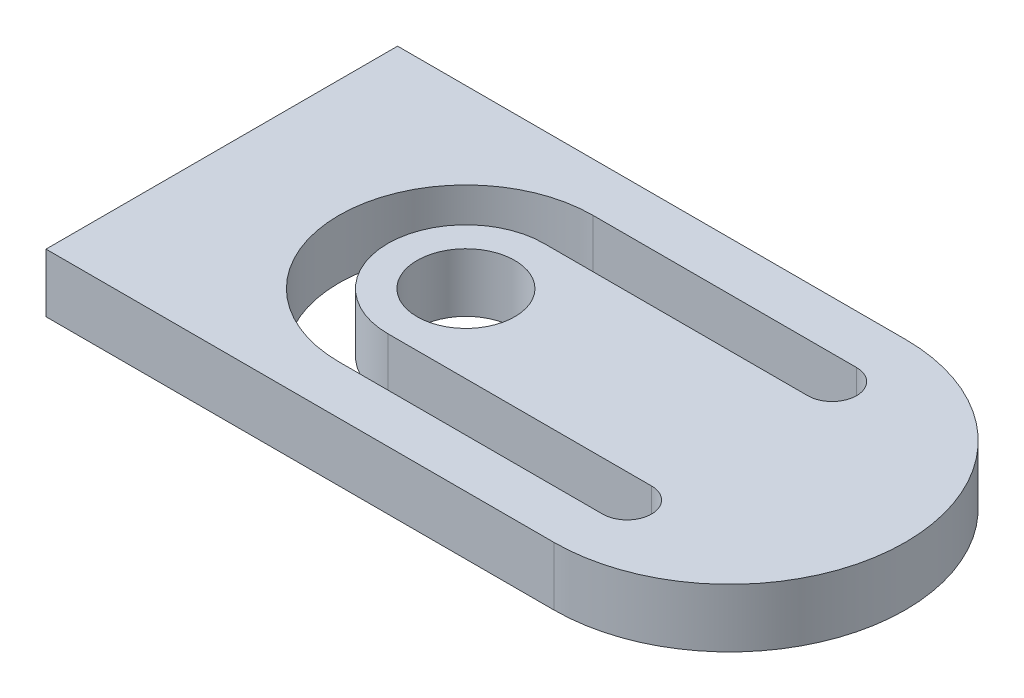
ISO-10303-21;
HEADER;
FILE_DESCRIPTION(('STEP AP214'),'2;1');
FILE_NAME('part.step','',(''),(''),'','','');
FILE_SCHEMA(('AUTOMOTIVE_DESIGN { 1 0 10303 214 1 1 1 1 }'));
ENDSEC;
DATA;
#1=APPLICATION_CONTEXT('core data for automotive mechanical design processes');
#2=APPLICATION_PROTOCOL_DEFINITION('international standard','automotive_design',2000,#1);
#3=PRODUCT_CONTEXT('',#1,'mechanical');
#4=PRODUCT('Part','Part','',(#3));
#5=PRODUCT_RELATED_PRODUCT_CATEGORY('part','',(#4));
#6=PRODUCT_DEFINITION_FORMATION('','',#4);
#7=PRODUCT_DEFINITION_CONTEXT('part definition',#1,'design');
#8=PRODUCT_DEFINITION('design','',#6,#7);
#9=PRODUCT_DEFINITION_SHAPE('','',#8);
#10=(LENGTH_UNIT() NAMED_UNIT(*) SI_UNIT(.MILLI.,.METRE.));
#11=(NAMED_UNIT(*) PLANE_ANGLE_UNIT() SI_UNIT($,.RADIAN.));
#12=(NAMED_UNIT(*) SI_UNIT($,.STERADIAN.) SOLID_ANGLE_UNIT());
#13=UNCERTAINTY_MEASURE_WITH_UNIT(LENGTH_MEASURE(1.E-05),#10,'distance_accuracy_value','');
#14=(GEOMETRIC_REPRESENTATION_CONTEXT(3) GLOBAL_UNCERTAINTY_ASSIGNED_CONTEXT((#13)) GLOBAL_UNIT_ASSIGNED_CONTEXT((#10,
#11,#12)) REPRESENTATION_CONTEXT('',''));
#15=CARTESIAN_POINT('',(0.,0.,0.));
#16=DIRECTION('',(0.,0.,1.));
#17=DIRECTION('',(1.,0.,0.));
#18=AXIS2_PLACEMENT_3D('',#15,#16,#17);
#19=CARTESIAN_POINT('',(6.64397905759164,3.,0.));
#20=DIRECTION('',(0.,-1.,0.));
#21=DIRECTION('',(0.,0.,-1.));
#22=AXIS2_PLACEMENT_3D('',#19,#20,#21);
#23=PLANE('',#22);
#24=CARTESIAN_POINT('',(-6.85602094240837,3.,0.));
#25=DIRECTION('',(0.,1.,0.));
#26=DIRECTION('',(0.,0.,1.));
#27=AXIS2_PLACEMENT_3D('',#24,#25,#26);
#28=CIRCLE('',#27,2.5);
#29=CARTESIAN_POINT('',(-6.85602094240837,3.,2.5));
#30=VERTEX_POINT('',#29);
#31=EDGE_CURVE('E188',#30,#30,#28,.T.);
#32=ORIENTED_EDGE('',*,*,#31,.F.);
#33=EDGE_LOOP('',(#32));
#34=FACE_BOUND('',#33,.T.);
#35=DIRECTION('',(0.,0.,1.));
#36=VECTOR('',#35,1.);
#37=CARTESIAN_POINT('',(-19.3560209424084,3.,-9.));
#38=LINE('',#37,#36);
#39=CARTESIAN_POINT('',(-19.3560209424084,3.,-9.));
#40=VERTEX_POINT('',#39);
#41=CARTESIAN_POINT('',(-19.3560209424084,3.,9.));
#42=VERTEX_POINT('',#41);
#43=EDGE_CURVE('E194',#40,#42,#38,.T.);
#44=ORIENTED_EDGE('',*,*,#43,.T.);
#45=DIRECTION('',(1.,0.,0.));
#46=VECTOR('',#45,1.);
#47=CARTESIAN_POINT('',(-19.3560209424084,3.,9.));
#48=LINE('',#47,#46);
#49=CARTESIAN_POINT('',(6.64397905759164,3.,9.00000000000001));
#50=VERTEX_POINT('',#49);
#51=EDGE_CURVE('E197',#42,#50,#48,.T.);
#52=ORIENTED_EDGE('',*,*,#51,.T.);
#53=CARTESIAN_POINT('',(6.64397905759164,3.,0.));
#54=DIRECTION('',(0.,1.,0.));
#55=DIRECTION('',(0.,0.,-1.));
#56=AXIS2_PLACEMENT_3D('',#53,#54,#55);
#57=CIRCLE('',#56,9.);
#58=CARTESIAN_POINT('',(6.64397905759163,3.,-9.));
#59=VERTEX_POINT('',#58);
#60=EDGE_CURVE('E200',#50,#59,#57,.T.);
#61=ORIENTED_EDGE('',*,*,#60,.T.);
#62=DIRECTION('',(-1.,0.,0.));
#63=VECTOR('',#62,1.);
#64=CARTESIAN_POINT('',(-19.3560209424084,3.,-9.));
#65=LINE('',#64,#63);
#66=EDGE_CURVE('E202',#59,#40,#65,.T.);
#67=ORIENTED_EDGE('',*,*,#66,.T.);
#68=EDGE_LOOP('',(#44,#52,#61,#67));
#69=FACE_BOUND('',#68,.T.);
#70=CARTESIAN_POINT('',(6.64397905759163,3.,-5.25));
#71=DIRECTION('',(0.,1.,0.));
#72=DIRECTION('',(0.,0.,-1.));
#73=AXIS2_PLACEMENT_3D('',#70,#71,#72);
#74=CIRCLE('',#73,1.25);
#75=CARTESIAN_POINT('',(6.64397905759163,3.,-4.));
#76=VERTEX_POINT('',#75);
#77=CARTESIAN_POINT('',(6.64397905759163,3.,-6.5));
#78=VERTEX_POINT('',#77);
#79=EDGE_CURVE('E123',#76,#78,#74,.T.);
#80=ORIENTED_EDGE('',*,*,#79,.F.);
#81=DIRECTION('',(1.,0.,0.));
#82=VECTOR('',#81,1.);
#83=CARTESIAN_POINT('',(-6.85602094240837,3.,-4.));
#84=LINE('',#83,#82);
#85=CARTESIAN_POINT('',(-6.85602094240837,3.,-4.));
#86=VERTEX_POINT('',#85);
#87=EDGE_CURVE('E156',#86,#76,#84,.T.);
#88=ORIENTED_EDGE('',*,*,#87,.F.);
#89=CARTESIAN_POINT('',(-6.85602094240837,3.,0.));
#90=DIRECTION('',(0.,-1.,0.));
#91=DIRECTION('',(0.,0.,1.));
#92=AXIS2_PLACEMENT_3D('',#89,#90,#91);
#93=CIRCLE('',#92,4.);
#94=CARTESIAN_POINT('',(-6.85602094240837,3.,4.));
#95=VERTEX_POINT('',#94);
#96=EDGE_CURVE('E154',#95,#86,#93,.T.);
#97=ORIENTED_EDGE('',*,*,#96,.F.);
#98=DIRECTION('',(-1.,0.,0.));
#99=VECTOR('',#98,1.);
#100=CARTESIAN_POINT('',(-6.85602094240837,3.,4.));
#101=LINE('',#100,#99);
#102=CARTESIAN_POINT('',(6.64397905759164,3.,4.));
#103=VERTEX_POINT('',#102);
#104=EDGE_CURVE('E152',#103,#95,#101,.T.);
#105=ORIENTED_EDGE('',*,*,#104,.F.);
#106=CARTESIAN_POINT('',(6.64397905759164,3.,5.25));
#107=DIRECTION('',(0.,1.,0.));
#108=DIRECTION('',(0.,0.,-1.));
#109=AXIS2_PLACEMENT_3D('',#106,#107,#108);
#110=CIRCLE('',#109,1.25);
#111=CARTESIAN_POINT('',(6.64397905759164,3.,6.5));
#112=VERTEX_POINT('',#111);
#113=EDGE_CURVE('E150',#112,#103,#110,.T.);
#114=ORIENTED_EDGE('',*,*,#113,.F.);
#115=DIRECTION('',(1.,0.,0.));
#116=VECTOR('',#115,1.);
#117=CARTESIAN_POINT('',(-6.85602094240837,3.,6.5));
#118=LINE('',#117,#116);
#119=CARTESIAN_POINT('',(-6.85602094240837,3.,6.5));
#120=VERTEX_POINT('',#119);
#121=EDGE_CURVE('E146',#120,#112,#118,.T.);
#122=ORIENTED_EDGE('',*,*,#121,.F.);
#123=CARTESIAN_POINT('',(-6.85602094240837,3.,0.));
#124=DIRECTION('',(0.,1.,0.));
#125=DIRECTION('',(0.,0.,1.));
#126=AXIS2_PLACEMENT_3D('',#123,#124,#125);
#127=CIRCLE('',#126,6.5);
#128=CARTESIAN_POINT('',(-6.85602094240837,3.,-6.5));
#129=VERTEX_POINT('',#128);
#130=EDGE_CURVE('E144',#129,#120,#127,.T.);
#131=ORIENTED_EDGE('',*,*,#130,.F.);
#132=DIRECTION('',(-1.,0.,0.));
#133=VECTOR('',#132,1.);
#134=CARTESIAN_POINT('',(-6.85602094240837,3.,-6.5));
#135=LINE('',#134,#133);
#136=EDGE_CURVE('E131',#78,#129,#135,.T.);
#137=ORIENTED_EDGE('',*,*,#136,.F.);
#138=EDGE_LOOP('',(#80,#88,#97,#105,#114,#122,#131,#137));
#139=FACE_BOUND('',#138,.T.);
#140=ADVANCED_FACE('F34',(#34,#69,#139),#23,.F.);
#141=CARTESIAN_POINT('',(6.64397905759164,0.,0.));
#142=DIRECTION('',(0.,-1.,0.));
#143=DIRECTION('',(0.,0.,-1.));
#144=AXIS2_PLACEMENT_3D('',#141,#142,#143);
#145=PLANE('',#144);
#146=DIRECTION('',(0.,0.,1.));
#147=VECTOR('',#146,1.);
#148=CARTESIAN_POINT('',(-19.3560209424084,0.,-9.));
#149=LINE('',#148,#147);
#150=CARTESIAN_POINT('',(-19.3560209424084,0.,-9.));
#151=VERTEX_POINT('',#150);
#152=CARTESIAN_POINT('',(-19.3560209424084,0.,9.));
#153=VERTEX_POINT('',#152);
#154=EDGE_CURVE('E191',#151,#153,#149,.T.);
#155=ORIENTED_EDGE('',*,*,#154,.F.);
#156=DIRECTION('',(-1.,0.,0.));
#157=VECTOR('',#156,1.);
#158=CARTESIAN_POINT('',(-19.3560209424084,0.,-9.));
#159=LINE('',#158,#157);
#160=CARTESIAN_POINT('',(6.64397905759163,0.,-9.));
#161=VERTEX_POINT('',#160);
#162=EDGE_CURVE('E198',#161,#151,#159,.T.);
#163=ORIENTED_EDGE('',*,*,#162,.F.);
#164=CARTESIAN_POINT('',(6.64397905759164,0.,0.));
#165=DIRECTION('',(0.,1.,0.));
#166=DIRECTION('',(0.,0.,-1.));
#167=AXIS2_PLACEMENT_3D('',#164,#165,#166);
#168=CIRCLE('',#167,9.);
#169=CARTESIAN_POINT('',(6.64397905759164,0.,9.00000000000001));
#170=VERTEX_POINT('',#169);
#171=EDGE_CURVE('E209',#170,#161,#168,.T.);
#172=ORIENTED_EDGE('',*,*,#171,.F.);
#173=DIRECTION('',(1.,0.,0.));
#174=VECTOR('',#173,1.);
#175=CARTESIAN_POINT('',(-19.3560209424084,0.,9.));
#176=LINE('',#175,#174);
#177=EDGE_CURVE('E207',#153,#170,#176,.T.);
#178=ORIENTED_EDGE('',*,*,#177,.F.);
#179=EDGE_LOOP('',(#155,#163,#172,#178));
#180=FACE_BOUND('',#179,.T.);
#181=CARTESIAN_POINT('',(-6.85602094240837,0.,0.));
#182=DIRECTION('',(0.,1.,0.));
#183=DIRECTION('',(0.,0.,1.));
#184=AXIS2_PLACEMENT_3D('',#181,#182,#183);
#185=CIRCLE('',#184,2.5);
#186=CARTESIAN_POINT('',(-6.85602094240837,0.,2.5));
#187=VERTEX_POINT('',#186);
#188=EDGE_CURVE('E139',#187,#187,#185,.T.);
#189=ORIENTED_EDGE('',*,*,#188,.T.);
#190=EDGE_LOOP('',(#189));
#191=FACE_BOUND('',#190,.T.);
#192=DIRECTION('',(1.,0.,0.));
#193=VECTOR('',#192,1.);
#194=CARTESIAN_POINT('',(-6.85602094240837,0.,-4.));
#195=LINE('',#194,#193);
#196=CARTESIAN_POINT('',(-6.85602094240837,0.,-4.));
#197=VERTEX_POINT('',#196);
#198=CARTESIAN_POINT('',(6.64397905759163,0.,-4.));
#199=VERTEX_POINT('',#198);
#200=EDGE_CURVE('E132',#197,#199,#195,.T.);
#201=ORIENTED_EDGE('',*,*,#200,.T.);
#202=CARTESIAN_POINT('',(6.64397905759163,0.,-5.25));
#203=DIRECTION('',(0.,1.,0.));
#204=DIRECTION('',(0.,0.,-1.));
#205=AXIS2_PLACEMENT_3D('',#202,#203,#204);
#206=CIRCLE('',#205,1.25);
#207=CARTESIAN_POINT('',(6.64397905759163,0.,-6.5));
#208=VERTEX_POINT('',#207);
#209=EDGE_CURVE('E57',#199,#208,#206,.T.);
#210=ORIENTED_EDGE('',*,*,#209,.T.);
#211=DIRECTION('',(-1.,0.,0.));
#212=VECTOR('',#211,1.);
#213=CARTESIAN_POINT('',(-6.85602094240837,0.,-6.5));
#214=LINE('',#213,#212);
#215=CARTESIAN_POINT('',(-6.85602094240837,0.,-6.5));
#216=VERTEX_POINT('',#215);
#217=EDGE_CURVE('E138',#208,#216,#214,.T.);
#218=ORIENTED_EDGE('',*,*,#217,.T.);
#219=CARTESIAN_POINT('',(-6.85602094240837,0.,0.));
#220=DIRECTION('',(0.,1.,0.));
#221=DIRECTION('',(0.,0.,1.));
#222=AXIS2_PLACEMENT_3D('',#219,#220,#221);
#223=CIRCLE('',#222,6.5);
#224=CARTESIAN_POINT('',(-6.85602094240837,0.,6.5));
#225=VERTEX_POINT('',#224);
#226=EDGE_CURVE('E160',#216,#225,#223,.T.);
#227=ORIENTED_EDGE('',*,*,#226,.T.);
#228=DIRECTION('',(1.,0.,0.));
#229=VECTOR('',#228,1.);
#230=CARTESIAN_POINT('',(-6.85602094240837,0.,6.5));
#231=LINE('',#230,#229);
#232=CARTESIAN_POINT('',(6.64397905759164,0.,6.5));
#233=VERTEX_POINT('',#232);
#234=EDGE_CURVE('E163',#225,#233,#231,.T.);
#235=ORIENTED_EDGE('',*,*,#234,.T.);
#236=CARTESIAN_POINT('',(6.64397905759164,0.,5.25));
#237=DIRECTION('',(0.,1.,0.));
#238=DIRECTION('',(0.,0.,-1.));
#239=AXIS2_PLACEMENT_3D('',#236,#237,#238);
#240=CIRCLE('',#239,1.25);
#241=CARTESIAN_POINT('',(6.64397905759164,0.,4.));
#242=VERTEX_POINT('',#241);
#243=EDGE_CURVE('E166',#233,#242,#240,.T.);
#244=ORIENTED_EDGE('',*,*,#243,.T.);
#245=DIRECTION('',(-1.,0.,0.));
#246=VECTOR('',#245,1.);
#247=CARTESIAN_POINT('',(-6.85602094240837,0.,4.));
#248=LINE('',#247,#246);
#249=CARTESIAN_POINT('',(-6.85602094240837,0.,4.));
#250=VERTEX_POINT('',#249);
#251=EDGE_CURVE('E169',#242,#250,#248,.T.);
#252=ORIENTED_EDGE('',*,*,#251,.T.);
#253=CARTESIAN_POINT('',(-6.85602094240837,0.,0.));
#254=DIRECTION('',(0.,-1.,0.));
#255=DIRECTION('',(0.,0.,1.));
#256=AXIS2_PLACEMENT_3D('',#253,#254,#255);
#257=CIRCLE('',#256,4.);
#258=EDGE_CURVE('E172',#250,#197,#257,.T.);
#259=ORIENTED_EDGE('',*,*,#258,.T.);
#260=EDGE_LOOP('',(#201,#210,#218,#227,#235,#244,#252,#259));
#261=FACE_BOUND('',#260,.T.);
#262=ADVANCED_FACE('F227',(#180,#191,#261),#145,.T.);
#263=CARTESIAN_POINT('',(-19.3560209424084,3.,-9.));
#264=DIRECTION('',(1.,0.,0.));
#265=DIRECTION('',(0.,0.,-1.));
#266=AXIS2_PLACEMENT_3D('',#263,#264,#265);
#267=PLANE('',#266);
#268=ORIENTED_EDGE('',*,*,#154,.T.);
#269=DIRECTION('',(0.,-1.,0.));
#270=VECTOR('',#269,1.);
#271=CARTESIAN_POINT('',(-19.3560209424084,3.,9.));
#272=LINE('',#271,#270);
#273=EDGE_CURVE('E11',#42,#153,#272,.T.);
#274=ORIENTED_EDGE('',*,*,#273,.F.);
#275=ORIENTED_EDGE('',*,*,#43,.F.);
#276=DIRECTION('',(0.,-1.,0.));
#277=VECTOR('',#276,1.);
#278=CARTESIAN_POINT('',(-19.3560209424084,3.,-9.));
#279=LINE('',#278,#277);
#280=EDGE_CURVE('E204',#40,#151,#279,.T.);
#281=ORIENTED_EDGE('',*,*,#280,.T.);
#282=EDGE_LOOP('',(#268,#274,#275,#281));
#283=FACE_BOUND('',#282,.T.);
#284=ADVANCED_FACE('F36',(#283),#267,.F.);
#285=CARTESIAN_POINT('',(-19.3560209424084,3.,9.));
#286=DIRECTION('',(0.,0.,-1.));
#287=DIRECTION('',(-1.,0.,0.));
#288=AXIS2_PLACEMENT_3D('',#285,#286,#287);
#289=PLANE('',#288);
#290=ORIENTED_EDGE('',*,*,#177,.T.);
#291=DIRECTION('',(0.,-1.,0.));
#292=VECTOR('',#291,1.);
#293=CARTESIAN_POINT('',(6.64397905759164,3.,9.00000000000001));
#294=LINE('',#293,#292);
#295=EDGE_CURVE('E42',#50,#170,#294,.T.);
#296=ORIENTED_EDGE('',*,*,#295,.F.);
#297=ORIENTED_EDGE('',*,*,#51,.F.);
#298=ORIENTED_EDGE('',*,*,#273,.T.);
#299=EDGE_LOOP('',(#290,#296,#297,#298));
#300=FACE_BOUND('',#299,.T.);
#301=ADVANCED_FACE('F237',(#300),#289,.F.);
#302=CARTESIAN_POINT('',(6.64397905759164,3.,0.));
#303=DIRECTION('',(0.,-1.,0.));
#304=DIRECTION('',(0.,0.,-1.));
#305=AXIS2_PLACEMENT_3D('',#302,#303,#304);
#306=CYLINDRICAL_SURFACE('',#305,9.);
#307=ORIENTED_EDGE('',*,*,#171,.T.);
#308=DIRECTION('',(0.,-1.,0.));
#309=VECTOR('',#308,1.);
#310=CARTESIAN_POINT('',(6.64397905759163,3.,-9.));
#311=LINE('',#310,#309);
#312=EDGE_CURVE('E214',#59,#161,#311,.T.);
#313=ORIENTED_EDGE('',*,*,#312,.F.);
#314=ORIENTED_EDGE('',*,*,#60,.F.);
#315=ORIENTED_EDGE('',*,*,#295,.T.);
#316=EDGE_LOOP('',(#307,#313,#314,#315));
#317=FACE_BOUND('',#316,.T.);
#318=ADVANCED_FACE('F221',(#317),#306,.T.);
#319=CARTESIAN_POINT('',(-19.3560209424084,3.,-9.));
#320=DIRECTION('',(0.,0.,1.));
#321=DIRECTION('',(1.,0.,0.));
#322=AXIS2_PLACEMENT_3D('',#319,#320,#321);
#323=PLANE('',#322);
#324=ORIENTED_EDGE('',*,*,#162,.T.);
#325=ORIENTED_EDGE('',*,*,#280,.F.);
#326=ORIENTED_EDGE('',*,*,#66,.F.);
#327=ORIENTED_EDGE('',*,*,#312,.T.);
#328=EDGE_LOOP('',(#324,#325,#326,#327));
#329=FACE_BOUND('',#328,.T.);
#330=ADVANCED_FACE('F231',(#329),#323,.F.);
#331=CARTESIAN_POINT('',(-6.85602094240837,3.,0.));
#332=DIRECTION('',(0.,-1.,0.));
#333=DIRECTION('',(0.,0.,-1.));
#334=AXIS2_PLACEMENT_3D('',#331,#332,#333);
#335=CYLINDRICAL_SURFACE('',#334,2.5);
#336=ORIENTED_EDGE('',*,*,#31,.T.);
#337=EDGE_LOOP('',(#336));
#338=FACE_BOUND('',#337,.T.);
#339=ORIENTED_EDGE('',*,*,#188,.F.);
#340=EDGE_LOOP('',(#339));
#341=FACE_BOUND('',#340,.T.);
#342=ADVANCED_FACE('F253',(#338,#341),#335,.F.);
#343=CARTESIAN_POINT('',(6.64397905759163,3.,-5.25));
#344=DIRECTION('',(0.,-1.,0.));
#345=DIRECTION('',(0.,0.,-1.));
#346=AXIS2_PLACEMENT_3D('',#343,#344,#345);
#347=CYLINDRICAL_SURFACE('',#346,1.25);
#348=ORIENTED_EDGE('',*,*,#209,.F.);
#349=DIRECTION('',(0.,-1.,0.));
#350=VECTOR('',#349,1.);
#351=CARTESIAN_POINT('',(6.64397905759163,3.,-4.));
#352=LINE('',#351,#350);
#353=EDGE_CURVE('E127',#76,#199,#352,.T.);
#354=ORIENTED_EDGE('',*,*,#353,.F.);
#355=ORIENTED_EDGE('',*,*,#79,.T.);
#356=DIRECTION('',(0.,-1.,0.));
#357=VECTOR('',#356,1.);
#358=CARTESIAN_POINT('',(6.64397905759163,3.,-6.5));
#359=LINE('',#358,#357);
#360=EDGE_CURVE('E126',#78,#208,#359,.T.);
#361=ORIENTED_EDGE('',*,*,#360,.T.);
#362=EDGE_LOOP('',(#348,#354,#355,#361));
#363=FACE_BOUND('',#362,.T.);
#364=ADVANCED_FACE('F125',(#363),#347,.F.);
#365=CARTESIAN_POINT('',(-6.85602094240837,3.,-6.5));
#366=DIRECTION('',(0.,0.,1.));
#367=DIRECTION('',(1.,0.,0.));
#368=AXIS2_PLACEMENT_3D('',#365,#366,#367);
#369=PLANE('',#368);
#370=ORIENTED_EDGE('',*,*,#217,.F.);
#371=ORIENTED_EDGE('',*,*,#360,.F.);
#372=ORIENTED_EDGE('',*,*,#136,.T.);
#373=DIRECTION('',(0.,-1.,0.));
#374=VECTOR('',#373,1.);
#375=CARTESIAN_POINT('',(-6.85602094240837,3.,-6.5));
#376=LINE('',#375,#374);
#377=EDGE_CURVE('E140',#129,#216,#376,.T.);
#378=ORIENTED_EDGE('',*,*,#377,.T.);
#379=EDGE_LOOP('',(#370,#371,#372,#378));
#380=FACE_BOUND('',#379,.T.);
#381=ADVANCED_FACE('F135',(#380),#369,.T.);
#382=CARTESIAN_POINT('',(-6.85602094240837,3.,0.));
#383=DIRECTION('',(0.,-1.,0.));
#384=DIRECTION('',(0.,0.,-1.));
#385=AXIS2_PLACEMENT_3D('',#382,#383,#384);
#386=CYLINDRICAL_SURFACE('',#385,6.5);
#387=ORIENTED_EDGE('',*,*,#226,.F.);
#388=ORIENTED_EDGE('',*,*,#377,.F.);
#389=ORIENTED_EDGE('',*,*,#130,.T.);
#390=DIRECTION('',(0.,-1.,0.));
#391=VECTOR('',#390,1.);
#392=CARTESIAN_POINT('',(-6.85602094240837,3.,6.5));
#393=LINE('',#392,#391);
#394=EDGE_CURVE('E185',#120,#225,#393,.T.);
#395=ORIENTED_EDGE('',*,*,#394,.T.);
#396=EDGE_LOOP('',(#387,#388,#389,#395));
#397=FACE_BOUND('',#396,.T.);
#398=ADVANCED_FACE('F289',(#397),#386,.F.);
#399=CARTESIAN_POINT('',(-6.85602094240837,3.,6.5));
#400=DIRECTION('',(0.,0.,-1.));
#401=DIRECTION('',(-1.,0.,0.));
#402=AXIS2_PLACEMENT_3D('',#399,#400,#401);
#403=PLANE('',#402);
#404=ORIENTED_EDGE('',*,*,#234,.F.);
#405=ORIENTED_EDGE('',*,*,#394,.F.);
#406=ORIENTED_EDGE('',*,*,#121,.T.);
#407=DIRECTION('',(0.,-1.,0.));
#408=VECTOR('',#407,1.);
#409=CARTESIAN_POINT('',(6.64397905759164,3.,6.5));
#410=LINE('',#409,#408);
#411=EDGE_CURVE('E183',#112,#233,#410,.T.);
#412=ORIENTED_EDGE('',*,*,#411,.T.);
#413=EDGE_LOOP('',(#404,#405,#406,#412));
#414=FACE_BOUND('',#413,.T.);
#415=ADVANCED_FACE('F286',(#414),#403,.T.);
#416=CARTESIAN_POINT('',(6.64397905759164,3.,5.25));
#417=DIRECTION('',(0.,-1.,0.));
#418=DIRECTION('',(0.,0.,-1.));
#419=AXIS2_PLACEMENT_3D('',#416,#417,#418);
#420=CYLINDRICAL_SURFACE('',#419,1.25);
#421=ORIENTED_EDGE('',*,*,#243,.F.);
#422=ORIENTED_EDGE('',*,*,#411,.F.);
#423=ORIENTED_EDGE('',*,*,#113,.T.);
#424=DIRECTION('',(0.,-1.,0.));
#425=VECTOR('',#424,1.);
#426=CARTESIAN_POINT('',(6.64397905759164,3.,4.));
#427=LINE('',#426,#425);
#428=EDGE_CURVE('E181',#103,#242,#427,.T.);
#429=ORIENTED_EDGE('',*,*,#428,.T.);
#430=EDGE_LOOP('',(#421,#422,#423,#429));
#431=FACE_BOUND('',#430,.T.);
#432=ADVANCED_FACE('F281',(#431),#420,.F.);
#433=CARTESIAN_POINT('',(-6.85602094240837,3.,4.));
#434=DIRECTION('',(0.,0.,1.));
#435=DIRECTION('',(1.,0.,0.));
#436=AXIS2_PLACEMENT_3D('',#433,#434,#435);
#437=PLANE('',#436);
#438=ORIENTED_EDGE('',*,*,#251,.F.);
#439=ORIENTED_EDGE('',*,*,#428,.F.);
#440=ORIENTED_EDGE('',*,*,#104,.T.);
#441=DIRECTION('',(0.,-1.,0.));
#442=VECTOR('',#441,1.);
#443=CARTESIAN_POINT('',(-6.85602094240837,3.,4.));
#444=LINE('',#443,#442);
#445=EDGE_CURVE('E179',#95,#250,#444,.T.);
#446=ORIENTED_EDGE('',*,*,#445,.T.);
#447=EDGE_LOOP('',(#438,#439,#440,#446));
#448=FACE_BOUND('',#447,.T.);
#449=ADVANCED_FACE('F277',(#448),#437,.T.);
#450=CARTESIAN_POINT('',(-6.85602094240837,3.,0.));
#451=DIRECTION('',(0.,-1.,0.));
#452=DIRECTION('',(0.,0.,-1.));
#453=AXIS2_PLACEMENT_3D('',#450,#451,#452);
#454=CYLINDRICAL_SURFACE('',#453,4.);
#455=ORIENTED_EDGE('',*,*,#258,.F.);
#456=ORIENTED_EDGE('',*,*,#445,.F.);
#457=ORIENTED_EDGE('',*,*,#96,.T.);
#458=DIRECTION('',(0.,-1.,0.));
#459=VECTOR('',#458,1.);
#460=CARTESIAN_POINT('',(-6.85602094240837,3.,-4.));
#461=LINE('',#460,#459);
#462=EDGE_CURVE('E49',#86,#197,#461,.T.);
#463=ORIENTED_EDGE('',*,*,#462,.T.);
#464=EDGE_LOOP('',(#455,#456,#457,#463));
#465=FACE_BOUND('',#464,.T.);
#466=ADVANCED_FACE('F274',(#465),#454,.T.);
#467=CARTESIAN_POINT('',(-6.85602094240837,3.,-4.));
#468=DIRECTION('',(0.,0.,-1.));
#469=DIRECTION('',(-1.,0.,0.));
#470=AXIS2_PLACEMENT_3D('',#467,#468,#469);
#471=PLANE('',#470);
#472=ORIENTED_EDGE('',*,*,#200,.F.);
#473=ORIENTED_EDGE('',*,*,#462,.F.);
#474=ORIENTED_EDGE('',*,*,#87,.T.);
#475=ORIENTED_EDGE('',*,*,#353,.T.);
#476=EDGE_LOOP('',(#472,#473,#474,#475));
#477=FACE_BOUND('',#476,.T.);
#478=ADVANCED_FACE('F268',(#477),#471,.T.);
#479=CLOSED_SHELL('',(#140,#262,#284,#301,#318,#330,#342,#364,#381,#398,#415,#432,#449,#466,#478));
#480=MANIFOLD_SOLID_BREP('B2',#479);
#481=ADVANCED_BREP_SHAPE_REPRESENTATION('',(#18,#480),#14);
#482=SHAPE_DEFINITION_REPRESENTATION(#9,#481);
ENDSEC;
END-ISO-10303-21;
